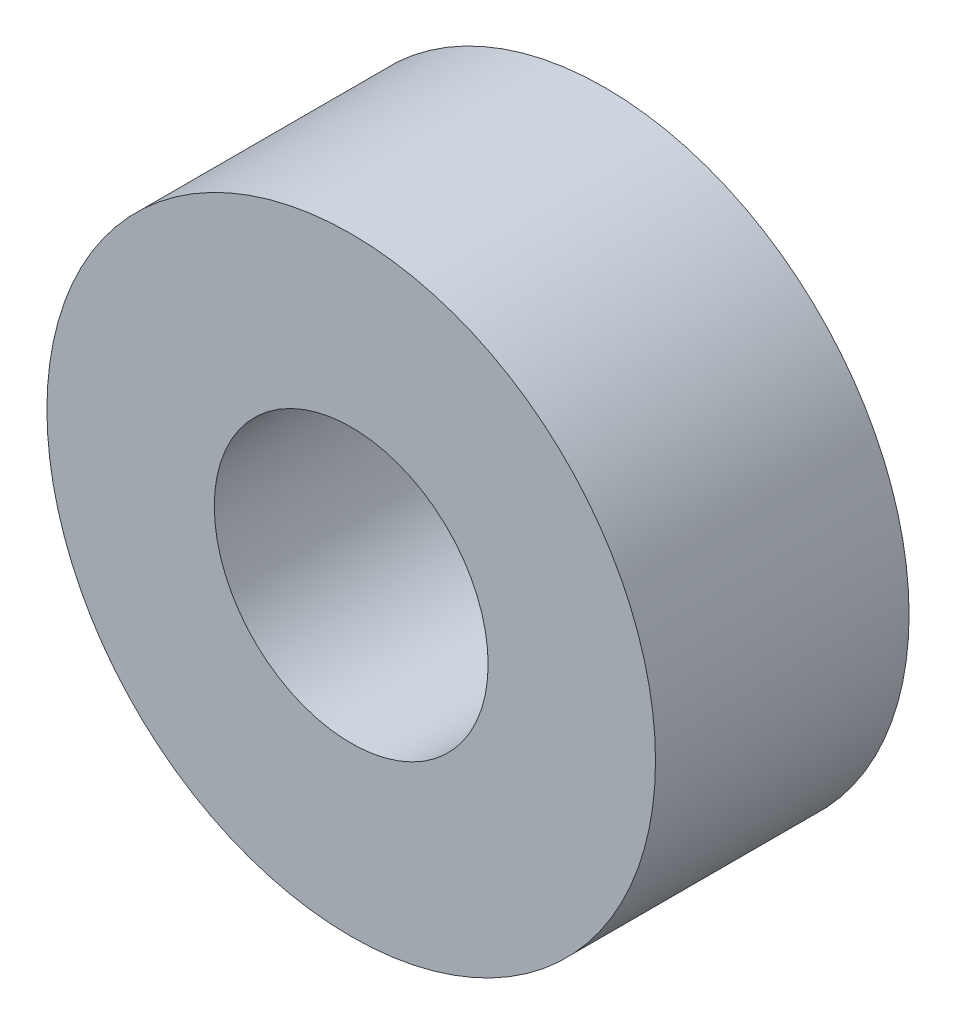
ISO-10303-21;
HEADER;
FILE_DESCRIPTION(('STEP AP214'),'2;1');
FILE_NAME('part.step','',(''),(''),'','','');
FILE_SCHEMA(('AUTOMOTIVE_DESIGN { 1 0 10303 214 1 1 1 1 }'));
ENDSEC;
DATA;
#1=APPLICATION_CONTEXT('core data for automotive mechanical design processes');
#2=APPLICATION_PROTOCOL_DEFINITION('international standard','automotive_design',2000,#1);
#3=PRODUCT_CONTEXT('',#1,'mechanical');
#4=PRODUCT('Part','Part','',(#3));
#5=PRODUCT_RELATED_PRODUCT_CATEGORY('part','',(#4));
#6=PRODUCT_DEFINITION_FORMATION('','',#4);
#7=PRODUCT_DEFINITION_CONTEXT('part definition',#1,'design');
#8=PRODUCT_DEFINITION('design','',#6,#7);
#9=PRODUCT_DEFINITION_SHAPE('','',#8);
#10=(LENGTH_UNIT() NAMED_UNIT(*) SI_UNIT(.MILLI.,.METRE.));
#11=(NAMED_UNIT(*) PLANE_ANGLE_UNIT() SI_UNIT($,.RADIAN.));
#12=(NAMED_UNIT(*) SI_UNIT($,.STERADIAN.) SOLID_ANGLE_UNIT());
#13=UNCERTAINTY_MEASURE_WITH_UNIT(LENGTH_MEASURE(1.E-05),#10,'distance_accuracy_value','');
#14=(GEOMETRIC_REPRESENTATION_CONTEXT(3) GLOBAL_UNCERTAINTY_ASSIGNED_CONTEXT((#13)) GLOBAL_UNIT_ASSIGNED_CONTEXT((#10,
#11,#12)) REPRESENTATION_CONTEXT('',''));
#15=CARTESIAN_POINT('',(0.,0.,0.));
#16=DIRECTION('',(0.,0.,1.));
#17=DIRECTION('',(1.,0.,0.));
#18=AXIS2_PLACEMENT_3D('',#15,#16,#17);
#19=CARTESIAN_POINT('',(0.,0.,2.5));
#20=DIRECTION('',(0.,0.,1.));
#21=DIRECTION('',(1.,0.,0.));
#22=AXIS2_PLACEMENT_3D('',#19,#20,#21);
#23=PLANE('',#22);
#24=CARTESIAN_POINT('',(0.,0.,2.5));
#25=DIRECTION('',(0.,0.,1.));
#26=DIRECTION('',(1.,0.,0.));
#27=AXIS2_PLACEMENT_3D('',#24,#25,#26);
#28=CIRCLE('',#27,3.);
#29=CARTESIAN_POINT('',(3.,0.,2.5));
#30=VERTEX_POINT('',#29);
#31=EDGE_CURVE('E10',#30,#30,#28,.T.);
#32=ORIENTED_EDGE('',*,*,#31,.T.);
#33=EDGE_LOOP('',(#32));
#34=FACE_BOUND('',#33,.T.);
#35=CARTESIAN_POINT('',(0.,0.,2.5));
#36=DIRECTION('',(0.,0.,1.));
#37=DIRECTION('',(1.,0.,0.));
#38=AXIS2_PLACEMENT_3D('',#35,#36,#37);
#39=CIRCLE('',#38,1.35);
#40=CARTESIAN_POINT('',(1.35,0.,2.5));
#41=VERTEX_POINT('',#40);
#42=EDGE_CURVE('E42',#41,#41,#39,.T.);
#43=ORIENTED_EDGE('',*,*,#42,.F.);
#44=EDGE_LOOP('',(#43));
#45=FACE_BOUND('',#44,.T.);
#46=ADVANCED_FACE('F31',(#34,#45),#23,.T.);
#47=CARTESIAN_POINT('',(0.,0.,0.));
#48=DIRECTION('',(0.,0.,1.));
#49=DIRECTION('',(1.,0.,0.));
#50=AXIS2_PLACEMENT_3D('',#47,#48,#49);
#51=PLANE('',#50);
#52=CARTESIAN_POINT('',(0.,0.,0.));
#53=DIRECTION('',(0.,0.,1.));
#54=DIRECTION('',(1.,0.,0.));
#55=AXIS2_PLACEMENT_3D('',#52,#53,#54);
#56=CIRCLE('',#55,3.);
#57=CARTESIAN_POINT('',(3.,0.,0.));
#58=VERTEX_POINT('',#57);
#59=EDGE_CURVE('E35',#58,#58,#56,.T.);
#60=ORIENTED_EDGE('',*,*,#59,.F.);
#61=EDGE_LOOP('',(#60));
#62=FACE_BOUND('',#61,.T.);
#63=CARTESIAN_POINT('',(0.,0.,0.));
#64=DIRECTION('',(0.,0.,1.));
#65=DIRECTION('',(1.,0.,0.));
#66=AXIS2_PLACEMENT_3D('',#63,#64,#65);
#67=CIRCLE('',#66,1.35);
#68=CARTESIAN_POINT('',(1.35,0.,0.));
#69=VERTEX_POINT('',#68);
#70=EDGE_CURVE('E44',#69,#69,#67,.T.);
#71=ORIENTED_EDGE('',*,*,#70,.T.);
#72=EDGE_LOOP('',(#71));
#73=FACE_BOUND('',#72,.T.);
#74=ADVANCED_FACE('F54',(#62,#73),#51,.F.);
#75=CARTESIAN_POINT('',(0.,0.,2.5));
#76=DIRECTION('',(0.,0.,-1.));
#77=DIRECTION('',(-1.,0.,0.));
#78=AXIS2_PLACEMENT_3D('',#75,#76,#77);
#79=CYLINDRICAL_SURFACE('',#78,3.);
#80=ORIENTED_EDGE('',*,*,#31,.F.);
#81=EDGE_LOOP('',(#80));
#82=FACE_BOUND('',#81,.T.);
#83=ORIENTED_EDGE('',*,*,#59,.T.);
#84=EDGE_LOOP('',(#83));
#85=FACE_BOUND('',#84,.T.);
#86=ADVANCED_FACE('F33',(#82,#85),#79,.T.);
#87=CARTESIAN_POINT('',(0.,0.,2.5));
#88=DIRECTION('',(0.,0.,-1.));
#89=DIRECTION('',(-1.,0.,0.));
#90=AXIS2_PLACEMENT_3D('',#87,#88,#89);
#91=CYLINDRICAL_SURFACE('',#90,1.35);
#92=ORIENTED_EDGE('',*,*,#42,.T.);
#93=EDGE_LOOP('',(#92));
#94=FACE_BOUND('',#93,.T.);
#95=ORIENTED_EDGE('',*,*,#70,.F.);
#96=EDGE_LOOP('',(#95));
#97=FACE_BOUND('',#96,.T.);
#98=ADVANCED_FACE('F50',(#94,#97),#91,.F.);
#99=CLOSED_SHELL('',(#46,#74,#86,#98));
#100=MANIFOLD_SOLID_BREP('B2',#99);
#101=ADVANCED_BREP_SHAPE_REPRESENTATION('',(#18,#100),#14);
#102=SHAPE_DEFINITION_REPRESENTATION(#9,#101);
ENDSEC;
END-ISO-10303-21;
